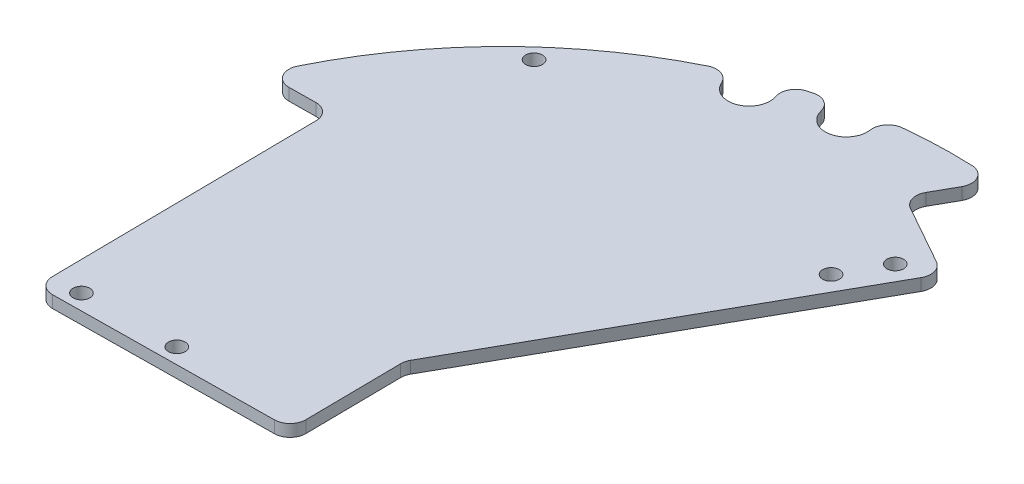
ISO-10303-21;
HEADER;
FILE_DESCRIPTION(('STEP AP214'),'2;1');
FILE_NAME('part.step','',(''),(''),'','','');
FILE_SCHEMA(('AUTOMOTIVE_DESIGN { 1 0 10303 214 1 1 1 1 }'));
ENDSEC;
DATA;
#1=APPLICATION_CONTEXT('core data for automotive mechanical design processes');
#2=APPLICATION_PROTOCOL_DEFINITION('international standard','automotive_design',2000,#1);
#3=PRODUCT_CONTEXT('',#1,'mechanical');
#4=PRODUCT('Part','Part','',(#3));
#5=PRODUCT_RELATED_PRODUCT_CATEGORY('part','',(#4));
#6=PRODUCT_DEFINITION_FORMATION('','',#4);
#7=PRODUCT_DEFINITION_CONTEXT('part definition',#1,'design');
#8=PRODUCT_DEFINITION('design','',#6,#7);
#9=PRODUCT_DEFINITION_SHAPE('','',#8);
#10=(LENGTH_UNIT() NAMED_UNIT(*) SI_UNIT(.MILLI.,.METRE.));
#11=(NAMED_UNIT(*) PLANE_ANGLE_UNIT() SI_UNIT($,.RADIAN.));
#12=(NAMED_UNIT(*) SI_UNIT($,.STERADIAN.) SOLID_ANGLE_UNIT());
#13=UNCERTAINTY_MEASURE_WITH_UNIT(LENGTH_MEASURE(1.E-05),#10,'distance_accuracy_value','');
#14=(GEOMETRIC_REPRESENTATION_CONTEXT(3) GLOBAL_UNCERTAINTY_ASSIGNED_CONTEXT((#13)) GLOBAL_UNIT_ASSIGNED_CONTEXT((#10,
#11,#12)) REPRESENTATION_CONTEXT('',''));
#15=CARTESIAN_POINT('',(0.,0.,0.));
#16=DIRECTION('',(0.,0.,1.));
#17=DIRECTION('',(1.,0.,0.));
#18=AXIS2_PLACEMENT_3D('',#15,#16,#17);
#19=CARTESIAN_POINT('',(2.70616862252382E-13,2.3,5.06539254985228E-13));
#20=DIRECTION('',(0.,-1.,0.));
#21=DIRECTION('',(0.,0.,-1.));
#22=AXIS2_PLACEMENT_3D('',#19,#20,#21);
#23=CYLINDRICAL_SURFACE('',#22,86.0000000000001);
#24=CARTESIAN_POINT('',(2.70616862252382E-13,2.3,5.06539254985228E-13));
#25=DIRECTION('',(0.,1.,0.));
#26=DIRECTION('',(0.,0.,1.));
#27=AXIS2_PLACEMENT_3D('',#24,#25,#26);
#28=CIRCLE('',#27,86.0000000000001);
#29=CARTESIAN_POINT('',(-23.5006192355601,2.3,-82.7267846319748));
#30=VERTEX_POINT('',#29);
#31=CARTESIAN_POINT('',(-24.4914733821832,2.3,-82.4388726971065));
#32=VERTEX_POINT('',#31);
#33=EDGE_CURVE('E271',#30,#32,#28,.T.);
#34=ORIENTED_EDGE('',*,*,#33,.F.);
#35=DIRECTION('',(0.,-1.,0.));
#36=VECTOR('',#35,1.);
#37=CARTESIAN_POINT('',(-23.5006192355601,2.3,-82.7267846319748));
#38=LINE('',#37,#36);
#39=CARTESIAN_POINT('',(-23.5006192355601,0.,-82.7267846319748));
#40=VERTEX_POINT('',#39);
#41=EDGE_CURVE('E459',#30,#40,#38,.T.);
#42=ORIENTED_EDGE('',*,*,#41,.T.);
#43=CARTESIAN_POINT('',(2.70616862252382E-13,0.,5.06539254985228E-13));
#44=DIRECTION('',(0.,1.,0.));
#45=DIRECTION('',(0.,0.,1.));
#46=AXIS2_PLACEMENT_3D('',#43,#44,#45);
#47=CIRCLE('',#46,86.0000000000001);
#48=CARTESIAN_POINT('',(-24.4914733821832,0.,-82.4388726971065));
#49=VERTEX_POINT('',#48);
#50=EDGE_CURVE('E241',#40,#49,#47,.T.);
#51=ORIENTED_EDGE('',*,*,#50,.T.);
#52=DIRECTION('',(0.,-1.,0.));
#53=VECTOR('',#52,1.);
#54=CARTESIAN_POINT('',(-24.4914733821832,2.3,-82.4388726971065));
#55=LINE('',#54,#53);
#56=EDGE_CURVE('E455',#49,#32,#55,.F.);
#57=ORIENTED_EDGE('',*,*,#56,.T.);
#58=EDGE_LOOP('',(#34,#42,#51,#57));
#59=FACE_BOUND('',#58,.T.);
#60=ADVANCED_FACE('F44',(#59),#23,.T.);
#61=CARTESIAN_POINT('',(3.70634819262841,0.,-85.9200965029424));
#62=VERTEX_POINT('',#61);
#63=CARTESIAN_POINT('',(-9.27498176513942,0.,-85.4983901208453));
#64=VERTEX_POINT('',#63);
#65=EDGE_CURVE('E226',#62,#64,#47,.T.);
#66=ORIENTED_EDGE('',*,*,#65,.T.);
#67=DIRECTION('',(0.,-1.,0.));
#68=VECTOR('',#67,1.);
#69=CARTESIAN_POINT('',(-9.27498176513942,2.3,-85.4983901208453));
#70=LINE('',#69,#68);
#71=CARTESIAN_POINT('',(-9.27498176513942,2.3,-85.4983901208453));
#72=VERTEX_POINT('',#71);
#73=EDGE_CURVE('E425',#64,#72,#70,.F.);
#74=ORIENTED_EDGE('',*,*,#73,.T.);
#75=CARTESIAN_POINT('',(3.70634819262841,2.3,-85.9200965029424));
#76=VERTEX_POINT('',#75);
#77=EDGE_CURVE('E229',#76,#72,#28,.T.);
#78=ORIENTED_EDGE('',*,*,#77,.F.);
#79=DIRECTION('',(0.,-1.,0.));
#80=VECTOR('',#79,1.);
#81=CARTESIAN_POINT('',(3.70634819262841,2.3,-85.9200965029424));
#82=LINE('',#81,#80);
#83=EDGE_CURVE('E212',#76,#62,#82,.T.);
#84=ORIENTED_EDGE('',*,*,#83,.T.);
#85=EDGE_LOOP('',(#66,#74,#78,#84));
#86=FACE_BOUND('',#85,.T.);
#87=ADVANCED_FACE('F224',(#86),#23,.T.);
#88=CARTESIAN_POINT('',(-37.987261940775,2.3,-77.1554789385878));
#89=VERTEX_POINT('',#88);
#90=CARTESIAN_POINT('',(-77.1712220659256,2.3,-37.9552695267934));
#91=VERTEX_POINT('',#90);
#92=EDGE_CURVE('E272',#89,#91,#28,.T.);
#93=ORIENTED_EDGE('',*,*,#92,.F.);
#94=DIRECTION('',(0.,-1.,0.));
#95=VECTOR('',#94,1.);
#96=CARTESIAN_POINT('',(-37.987261940775,2.3,-77.1554789385878));
#97=LINE('',#96,#95);
#98=CARTESIAN_POINT('',(-37.987261940775,0.,-77.1554789385878));
#99=VERTEX_POINT('',#98);
#100=EDGE_CURVE('E462',#89,#99,#97,.T.);
#101=ORIENTED_EDGE('',*,*,#100,.T.);
#102=CARTESIAN_POINT('',(-77.1712220659256,0.,-37.9552695267934));
#103=VERTEX_POINT('',#102);
#104=EDGE_CURVE('E243',#99,#103,#47,.T.);
#105=ORIENTED_EDGE('',*,*,#104,.T.);
#106=DIRECTION('',(0.,-1.,0.));
#107=VECTOR('',#106,1.);
#108=CARTESIAN_POINT('',(-77.1712220659256,2.3,-37.9552695267934));
#109=LINE('',#108,#107);
#110=EDGE_CURVE('E232',#103,#91,#109,.F.);
#111=ORIENTED_EDGE('',*,*,#110,.T.);
#112=EDGE_LOOP('',(#93,#101,#105,#111));
#113=FACE_BOUND('',#112,.T.);
#114=ADVANCED_FACE('F588',(#113),#23,.T.);
#115=CARTESIAN_POINT('',(-0.403581113949458,2.3,-34.4976393726353));
#116=DIRECTION('',(0.0116980033028831,0.,0.999931576018442));
#117=DIRECTION('',(0.999931576018442,0.,-0.0116980033028831));
#118=AXIS2_PLACEMENT_3D('',#115,#116,#117);
#119=PLANE('',#118);
#120=DIRECTION('',(-0.999931576018442,0.,0.0116980033028831));
#121=VECTOR('',#120,1.);
#122=CARTESIAN_POINT('',(-0.403581113949458,0.,-34.4976393726353));
#123=LINE('',#122,#121);
#124=CARTESIAN_POINT('',(-69.3988598592225,0.,-33.6904771447364));
#125=VERTEX_POINT('',#124);
#126=CARTESIAN_POINT('',(-74.4441086816242,0.,-33.6314537687337));
#127=VERTEX_POINT('',#126);
#128=EDGE_CURVE('E240',#125,#127,#123,.T.);
#129=ORIENTED_EDGE('',*,*,#128,.F.);
#130=DIRECTION('',(0.,-1.,0.));
#131=VECTOR('',#130,1.);
#132=CARTESIAN_POINT('',(-69.3988598592225,2.3,-33.6904771447364));
#133=LINE('',#132,#131);
#134=CARTESIAN_POINT('',(-69.3988598592225,2.3,-33.6904771447364));
#135=VERTEX_POINT('',#134);
#136=EDGE_CURVE('E398',#125,#135,#133,.F.);
#137=ORIENTED_EDGE('',*,*,#136,.T.);
#138=DIRECTION('',(-0.999931576018442,0.,0.0116980033028831));
#139=VECTOR('',#138,1.);
#140=CARTESIAN_POINT('',(-0.403581113949458,2.3,-34.4976393726353));
#141=LINE('',#140,#139);
#142=CARTESIAN_POINT('',(-74.4441086816242,2.3,-33.6314537687337));
#143=VERTEX_POINT('',#142);
#144=EDGE_CURVE('E270',#135,#143,#141,.T.);
#145=ORIENTED_EDGE('',*,*,#144,.T.);
#146=DIRECTION('',(0.,1.,0.));
#147=VECTOR('',#146,1.);
#148=CARTESIAN_POINT('',(-74.4441086816242,0.,-33.6314537687337));
#149=LINE('',#148,#147);
#150=EDGE_CURVE('E394',#143,#127,#149,.F.);
#151=ORIENTED_EDGE('',*,*,#150,.T.);
#152=EDGE_LOOP('',(#129,#137,#145,#151));
#153=FACE_BOUND('',#152,.T.);
#154=ADVANCED_FACE('F596',(#153),#119,.T.);
#155=CARTESIAN_POINT('',(-65.9954840172177,2.3,0.772068217990372));
#156=DIRECTION('',(-0.999931576018442,0.,0.0116980033028843));
#157=DIRECTION('',(0.0116980033028843,0.,0.999931576018442));
#158=AXIS2_PLACEMENT_3D('',#155,#156,#157);
#159=PLANE('',#158);
#160=DIRECTION('',(-0.0116980033028843,0.,-0.999931576018442));
#161=VECTOR('',#160,1.);
#162=CARTESIAN_POINT('',(-65.9954840172177,0.,0.772068217990372));
#163=LINE('',#162,#161);
#164=CARTESIAN_POINT('',(-65.7673729528114,0.,20.2707339503508));
#165=VERTEX_POINT('',#164);
#166=CARTESIAN_POINT('',(-66.3639711212585,0.,-30.7257764265897));
#167=VERTEX_POINT('',#166);
#168=EDGE_CURVE('E247',#165,#167,#163,.T.);
#169=ORIENTED_EDGE('',*,*,#168,.F.);
#170=DIRECTION('',(0.,-1.,0.));
#171=VECTOR('',#170,1.);
#172=CARTESIAN_POINT('',(-65.7673729528114,2.3,20.2707339503508));
#173=LINE('',#172,#171);
#174=CARTESIAN_POINT('',(-65.7673729528114,2.3,20.2707339503508));
#175=VERTEX_POINT('',#174);
#176=EDGE_CURVE('E391',#165,#175,#173,.F.);
#177=ORIENTED_EDGE('',*,*,#176,.T.);
#178=DIRECTION('',(-0.0116980033028843,0.,-0.999931576018442));
#179=VECTOR('',#178,1.);
#180=CARTESIAN_POINT('',(-65.9954840172177,2.3,0.772068217990372));
#181=LINE('',#180,#179);
#182=CARTESIAN_POINT('',(-66.3639711212585,2.3,-30.7257764265897));
#183=VERTEX_POINT('',#182);
#184=EDGE_CURVE('E276',#175,#183,#181,.T.);
#185=ORIENTED_EDGE('',*,*,#184,.T.);
#186=DIRECTION('',(0.,-1.,0.));
#187=VECTOR('',#186,1.);
#188=CARTESIAN_POINT('',(-66.3639711212585,0.,-30.7257764265897));
#189=LINE('',#188,#187);
#190=EDGE_CURVE('E387',#183,#167,#189,.T.);
#191=ORIENTED_EDGE('',*,*,#190,.T.);
#192=EDGE_LOOP('',(#169,#177,#185,#191));
#193=FACE_BOUND('',#192,.T.);
#194=ADVANCED_FACE('F527',(#193),#159,.T.);
#195=CARTESIAN_POINT('',(0.263205074314909,2.3,22.4984604604158));
#196=DIRECTION('',(0.0116980033028844,0.,0.999931576018442));
#197=DIRECTION('',(0.999931576018442,0.,-0.0116980033028844));
#198=AXIS2_PLACEMENT_3D('',#195,#196,#197);
#199=PLANE('',#198);
#200=DIRECTION('',(-0.999931576018442,0.,0.0116980033028845));
#201=VECTOR('',#200,1.);
#202=CARTESIAN_POINT('',(0.263205074314909,0.,22.4984604604158));
#203=LINE('',#202,#201);
#204=CARTESIAN_POINT('',(-20.8520979978376,0.,22.7454842478463));
#205=VERTEX_POINT('',#204);
#206=CARTESIAN_POINT('',(-62.7324842148475,0.,23.2354346684975));
#207=VERTEX_POINT('',#206);
#208=EDGE_CURVE('E517',#205,#207,#203,.T.);
#209=ORIENTED_EDGE('',*,*,#208,.F.);
#210=DIRECTION('',(0.,-1.,0.));
#211=VECTOR('',#210,1.);
#212=CARTESIAN_POINT('',(-20.8520979978376,2.3,22.7454842478463));
#213=LINE('',#212,#211);
#214=CARTESIAN_POINT('',(-20.8520979978376,2.3,22.7454842478463));
#215=VERTEX_POINT('',#214);
#216=EDGE_CURVE('E384',#205,#215,#213,.F.);
#217=ORIENTED_EDGE('',*,*,#216,.T.);
#218=DIRECTION('',(-0.999931576018442,0.,0.0116980033028845));
#219=VECTOR('',#218,1.);
#220=CARTESIAN_POINT('',(0.263205074314909,2.3,22.4984604604158));
#221=LINE('',#220,#219);
#222=CARTESIAN_POINT('',(-62.7324842148475,2.3,23.2354346684975));
#223=VERTEX_POINT('',#222);
#224=EDGE_CURVE('E280',#215,#223,#221,.T.);
#225=ORIENTED_EDGE('',*,*,#224,.T.);
#226=DIRECTION('',(0.,-1.,0.));
#227=VECTOR('',#226,1.);
#228=CARTESIAN_POINT('',(-62.7324842148474,2.3,23.2354346684975));
#229=LINE('',#228,#227);
#230=EDGE_CURVE('E380',#223,#207,#229,.T.);
#231=ORIENTED_EDGE('',*,*,#230,.T.);
#232=EDGE_LOOP('',(#209,#217,#225,#231));
#233=FACE_BOUND('',#232,.T.);
#234=ADVANCED_FACE('F538',(#233),#199,.T.);
#235=CARTESIAN_POINT('',(-18.1155083440972,2.3,0.211929777521855));
#236=DIRECTION('',(0.999931576018442,0.,-0.0116980033028837));
#237=DIRECTION('',(-0.0116980033028837,0.,-0.999931576018442));
#238=AXIS2_PLACEMENT_3D('',#235,#236,#237);
#239=PLANE('',#238);
#240=DIRECTION('',(0.0116980033028837,0.,0.999931576018442));
#241=VECTOR('',#240,1.);
#242=CARTESIAN_POINT('',(-18.1155083440972,0.,0.211929777521855));
#243=LINE('',#242,#241);
#244=CARTESIAN_POINT('',(-18.1016698925678,0.,1.39482435270254));
#245=VERTEX_POINT('',#244);
#246=CARTESIAN_POINT('',(-17.887397279691,0.,19.7105955098823));
#247=VERTEX_POINT('',#246);
#248=EDGE_CURVE('E513',#245,#247,#243,.T.);
#249=ORIENTED_EDGE('',*,*,#248,.F.);
#250=DIRECTION('',(0.,-1.,0.));
#251=VECTOR('',#250,1.);
#252=CARTESIAN_POINT('',(-18.1016698925678,2.3,1.39482435270254));
#253=LINE('',#252,#251);
#254=CARTESIAN_POINT('',(-18.1016698925678,2.3,1.39482435270254));
#255=VERTEX_POINT('',#254);
#256=EDGE_CURVE('E377',#245,#255,#253,.F.);
#257=ORIENTED_EDGE('',*,*,#256,.T.);
#258=DIRECTION('',(0.0116980033028837,0.,0.999931576018442));
#259=VECTOR('',#258,1.);
#260=CARTESIAN_POINT('',(-18.1155083440972,2.3,0.211929777521855));
#261=LINE('',#260,#259);
#262=CARTESIAN_POINT('',(-17.887397279691,2.3,19.7105955098823));
#263=VERTEX_POINT('',#262);
#264=EDGE_CURVE('E284',#255,#263,#261,.T.);
#265=ORIENTED_EDGE('',*,*,#264,.T.);
#266=DIRECTION('',(0.,-1.,0.));
#267=VECTOR('',#266,1.);
#268=CARTESIAN_POINT('',(-17.887397279691,2.3,19.7105955098823));
#269=LINE('',#268,#267);
#270=EDGE_CURVE('E373',#263,#247,#269,.T.);
#271=ORIENTED_EDGE('',*,*,#270,.T.);
#272=EDGE_LOOP('',(#249,#257,#265,#271));
#273=FACE_BOUND('',#272,.T.);
#274=ADVANCED_FACE('F547',(#273),#239,.T.);
#275=CARTESIAN_POINT('',(-13.5131348022104,2.3,-7.59244280961925));
#276=DIRECTION('',(0.871815148529614,0.,0.489835019975386));
#277=DIRECTION('',(0.489835019975386,0.,-0.871815148529614));
#278=AXIS2_PLACEMENT_3D('',#275,#276,#277);
#279=PLANE('',#278);
#280=DIRECTION('',(-0.489835019975386,0.,0.871815148529615));
#281=VECTOR('',#280,1.);
#282=CARTESIAN_POINT('',(-13.5131348022104,0.,-7.59244280961925));
#283=LINE('',#282,#281);
#284=CARTESIAN_POINT('',(17.3464714562384,0.,-62.516797166984));
#285=VERTEX_POINT('',#284);
#286=CARTESIAN_POINT('',(-17.7173206101013,0.,-0.109774717132265));
#287=VERTEX_POINT('',#286);
#288=EDGE_CURVE('E509',#285,#287,#283,.T.);
#289=ORIENTED_EDGE('',*,*,#288,.F.);
#290=DIRECTION('',(0.,-1.,0.));
#291=VECTOR('',#290,1.);
#292=CARTESIAN_POINT('',(17.3464714562384,2.3,-62.516797166984));
#293=LINE('',#292,#291);
#294=CARTESIAN_POINT('',(17.3464714562384,2.3,-62.516797166984));
#295=VERTEX_POINT('',#294);
#296=EDGE_CURVE('E370',#285,#295,#293,.F.);
#297=ORIENTED_EDGE('',*,*,#296,.T.);
#298=DIRECTION('',(-0.489835019975386,0.,0.871815148529615));
#299=VECTOR('',#298,1.);
#300=CARTESIAN_POINT('',(-13.5131348022104,2.3,-7.59244280961925));
#301=LINE('',#300,#299);
#302=CARTESIAN_POINT('',(-17.7173206101013,2.3,-0.109774717132265));
#303=VERTEX_POINT('',#302);
#304=EDGE_CURVE('E288',#295,#303,#301,.T.);
#305=ORIENTED_EDGE('',*,*,#304,.T.);
#306=DIRECTION('',(0.,-1.,0.));
#307=VECTOR('',#306,1.);
#308=CARTESIAN_POINT('',(-17.7173206101013,0.,-0.109774717132265));
#309=LINE('',#308,#307);
#310=EDGE_CURVE('E366',#303,#287,#309,.T.);
#311=ORIENTED_EDGE('',*,*,#310,.T.);
#312=EDGE_LOOP('',(#289,#297,#305,#311));
#313=FACE_BOUND('',#312,.T.);
#314=ADVANCED_FACE('F556',(#313),#279,.T.);
#315=CARTESIAN_POINT('',(32.329111318375,2.3,-57.5397998029536));
#316=DIRECTION('',(-0.489835019975386,0.,0.871815148529614));
#317=DIRECTION('',(0.871815148529614,0.,0.489835019975386));
#318=AXIS2_PLACEMENT_3D('',#315,#316,#317);
#319=PLANE('',#318);
#320=DIRECTION('',(-0.871815148529614,0.,-0.489835019975386));
#321=VECTOR('',#320,1.);
#322=CARTESIAN_POINT('',(32.329111318375,0.,-57.5397998029536));
#323=LINE('',#322,#321);
#324=CARTESIAN_POINT('',(16.2005310705757,0.,-66.601747672499));
#325=VERTEX_POINT('',#324);
#326=CARTESIAN_POINT('',(4.86693413969206,0.,-72.9696029321783));
#327=VERTEX_POINT('',#326);
#328=EDGE_CURVE('E505',#325,#327,#323,.T.);
#329=ORIENTED_EDGE('',*,*,#328,.T.);
#330=DIRECTION('',(0.,-1.,0.));
#331=VECTOR('',#330,1.);
#332=CARTESIAN_POINT('',(4.86693413969206,2.3,-72.9696029321783));
#333=LINE('',#332,#331);
#334=CARTESIAN_POINT('',(4.86693413969206,2.3,-72.9696029321783));
#335=VERTEX_POINT('',#334);
#336=EDGE_CURVE('E363',#327,#335,#333,.F.);
#337=ORIENTED_EDGE('',*,*,#336,.T.);
#338=DIRECTION('',(-0.871815148529614,0.,-0.489835019975386));
#339=VECTOR('',#338,1.);
#340=CARTESIAN_POINT('',(32.329111318375,2.3,-57.5397998029536));
#341=LINE('',#340,#339);
#342=CARTESIAN_POINT('',(16.2005310705757,2.3,-66.601747672499));
#343=VERTEX_POINT('',#342);
#344=EDGE_CURVE('E292',#343,#335,#341,.T.);
#345=ORIENTED_EDGE('',*,*,#344,.F.);
#346=DIRECTION('',(0.,-1.,0.));
#347=VECTOR('',#346,1.);
#348=CARTESIAN_POINT('',(16.2005310705757,0.,-66.601747672499));
#349=LINE('',#348,#347);
#350=EDGE_CURVE('E359',#343,#325,#349,.T.);
#351=ORIENTED_EDGE('',*,*,#350,.T.);
#352=EDGE_LOOP('',(#329,#337,#345,#351));
#353=FACE_BOUND('',#352,.T.);
#354=ADVANCED_FACE('F564',(#353),#319,.F.);
#355=CARTESIAN_POINT('',(-60.26774928471,2.3,20.2063949321849));
#356=DIRECTION('',(0.,-1.,0.));
#357=DIRECTION('',(0.,0.,-1.));
#358=AXIS2_PLACEMENT_3D('',#355,#356,#357);
#359=CYLINDRICAL_SURFACE('',#358,1.60000000000002);
#360=CARTESIAN_POINT('',(-60.26774928471,2.3,20.2063949321849));
#361=DIRECTION('',(0.,1.,0.));
#362=DIRECTION('',(0.,0.,1.));
#363=AXIS2_PLACEMENT_3D('',#360,#361,#362);
#364=CIRCLE('',#363,1.60000000000002);
#365=CARTESIAN_POINT('',(-60.26774928471,2.3,21.806394932185));
#366=VERTEX_POINT('',#365);
#367=EDGE_CURVE('E312',#366,#366,#364,.T.);
#368=ORIENTED_EDGE('',*,*,#367,.T.);
#369=EDGE_LOOP('',(#368));
#370=FACE_BOUND('',#369,.T.);
#371=CARTESIAN_POINT('',(-60.26774928471,0.,20.2063949321849));
#372=DIRECTION('',(0.,1.,0.));
#373=DIRECTION('',(0.,0.,1.));
#374=AXIS2_PLACEMENT_3D('',#371,#372,#373);
#375=CIRCLE('',#374,1.60000000000002);
#376=CARTESIAN_POINT('',(-60.26774928471,0.,21.806394932185));
#377=VERTEX_POINT('',#376);
#378=EDGE_CURVE('E482',#377,#377,#375,.T.);
#379=ORIENTED_EDGE('',*,*,#378,.F.);
#380=EDGE_LOOP('',(#379));
#381=FACE_BOUND('',#380,.T.);
#382=ADVANCED_FACE('F647',(#370,#381),#359,.F.);
#383=CARTESIAN_POINT('',(-42.268980916378,2.3,19.995830872733));
#384=DIRECTION('',(0.,-1.,0.));
#385=DIRECTION('',(0.,0.,-1.));
#386=AXIS2_PLACEMENT_3D('',#383,#384,#385);
#387=CYLINDRICAL_SURFACE('',#386,1.60000000000002);
#388=CARTESIAN_POINT('',(-42.268980916378,2.3,19.995830872733));
#389=DIRECTION('',(0.,1.,0.));
#390=DIRECTION('',(0.,0.,1.));
#391=AXIS2_PLACEMENT_3D('',#388,#389,#390);
#392=CIRCLE('',#391,1.60000000000002);
#393=CARTESIAN_POINT('',(-42.268980916378,2.3,21.595830872733));
#394=VERTEX_POINT('',#393);
#395=EDGE_CURVE('E308',#394,#394,#392,.T.);
#396=ORIENTED_EDGE('',*,*,#395,.T.);
#397=EDGE_LOOP('',(#396));
#398=FACE_BOUND('',#397,.T.);
#399=CARTESIAN_POINT('',(-42.268980916378,0.,19.995830872733));
#400=DIRECTION('',(0.,1.,0.));
#401=DIRECTION('',(0.,0.,1.));
#402=AXIS2_PLACEMENT_3D('',#399,#400,#401);
#403=CIRCLE('',#402,1.60000000000002);
#404=CARTESIAN_POINT('',(-42.268980916378,0.,21.595830872733));
#405=VERTEX_POINT('',#404);
#406=EDGE_CURVE('E487',#405,#405,#403,.T.);
#407=ORIENTED_EDGE('',*,*,#406,.F.);
#408=EDGE_LOOP('',(#407));
#409=FACE_BOUND('',#408,.T.);
#410=ADVANCED_FACE('F650',(#398,#409),#387,.F.);
#411=CARTESIAN_POINT('',(8.22610813240298,2.3,-54.4502630387947));
#412=DIRECTION('',(0.,-1.,0.));
#413=DIRECTION('',(0.,0.,-1.));
#414=AXIS2_PLACEMENT_3D('',#411,#412,#413);
#415=CYLINDRICAL_SURFACE('',#414,1.60000000000001);
#416=CARTESIAN_POINT('',(8.22610813240298,2.3,-54.4502630387947));
#417=DIRECTION('',(0.,1.,0.));
#418=DIRECTION('',(0.,0.,1.));
#419=AXIS2_PLACEMENT_3D('',#416,#417,#418);
#420=CIRCLE('',#419,1.60000000000001);
#421=CARTESIAN_POINT('',(8.22610813240298,2.3,-52.8502630387947));
#422=VERTEX_POINT('',#421);
#423=EDGE_CURVE('E304',#422,#422,#420,.T.);
#424=ORIENTED_EDGE('',*,*,#423,.T.);
#425=EDGE_LOOP('',(#424));
#426=FACE_BOUND('',#425,.T.);
#427=CARTESIAN_POINT('',(8.22610813240298,0.,-54.4502630387947));
#428=DIRECTION('',(0.,1.,0.));
#429=DIRECTION('',(0.,0.,1.));
#430=AXIS2_PLACEMENT_3D('',#427,#428,#429);
#431=CIRCLE('',#430,1.60000000000001);
#432=CARTESIAN_POINT('',(8.22610813240298,0.,-52.8502630387947));
#433=VERTEX_POINT('',#432);
#434=EDGE_CURVE('E492',#433,#433,#431,.T.);
#435=ORIENTED_EDGE('',*,*,#434,.F.);
#436=EDGE_LOOP('',(#435));
#437=FACE_BOUND('',#436,.T.);
#438=ADVANCED_FACE('F582',(#426,#437),#415,.F.);
#439=CARTESIAN_POINT('',(12.6346233121813,2.3,-62.2965993755613));
#440=DIRECTION('',(0.,-1.,0.));
#441=DIRECTION('',(0.,0.,-1.));
#442=AXIS2_PLACEMENT_3D('',#439,#440,#441);
#443=CYLINDRICAL_SURFACE('',#442,1.60000000000001);
#444=CARTESIAN_POINT('',(12.6346233121813,2.3,-62.2965993755613));
#445=DIRECTION('',(0.,1.,0.));
#446=DIRECTION('',(0.,0.,1.));
#447=AXIS2_PLACEMENT_3D('',#444,#445,#446);
#448=CIRCLE('',#447,1.60000000000001);
#449=CARTESIAN_POINT('',(12.6346233121813,2.3,-60.6965993755613));
#450=VERTEX_POINT('',#449);
#451=EDGE_CURVE('E300',#450,#450,#448,.T.);
#452=ORIENTED_EDGE('',*,*,#451,.T.);
#453=EDGE_LOOP('',(#452));
#454=FACE_BOUND('',#453,.T.);
#455=CARTESIAN_POINT('',(12.6346233121813,0.,-62.2965993755613));
#456=DIRECTION('',(0.,1.,0.));
#457=DIRECTION('',(0.,0.,1.));
#458=AXIS2_PLACEMENT_3D('',#455,#456,#457);
#459=CIRCLE('',#458,1.60000000000001);
#460=CARTESIAN_POINT('',(12.6346233121813,0.,-60.6965993755613));
#461=VERTEX_POINT('',#460);
#462=EDGE_CURVE('E498',#461,#461,#459,.T.);
#463=ORIENTED_EDGE('',*,*,#462,.F.);
#464=EDGE_LOOP('',(#463));
#465=FACE_BOUND('',#464,.T.);
#466=ADVANCED_FACE('F575',(#454,#465),#443,.F.);
#467=CARTESIAN_POINT('',(-30.0776226242717,2.3,-16.8993081891508));
#468=DIRECTION('',(-0.871815148529615,0.,-0.489835019975385));
#469=DIRECTION('',(-0.489835019975385,0.,0.871815148529615));
#470=AXIS2_PLACEMENT_3D('',#467,#468,#469);
#471=PLANE('',#470);
#472=DIRECTION('',(0.489835019975385,0.,-0.871815148529615));
#473=VECTOR('',#472,1.);
#474=CARTESIAN_POINT('',(-30.0776226242717,0.,-16.8993081891508));
#475=LINE('',#474,#473);
#476=CARTESIAN_POINT('',(3.72099375402938,0.,-77.0545534376933));
#477=VERTEX_POINT('',#476);
#478=CARTESIAN_POINT('',(6.19250242219533,0.,-81.4533787743089));
#479=VERTEX_POINT('',#478);
#480=EDGE_CURVE('E502',#477,#479,#475,.T.);
#481=ORIENTED_EDGE('',*,*,#480,.T.);
#482=DIRECTION('',(0.,-1.,0.));
#483=VECTOR('',#482,1.);
#484=CARTESIAN_POINT('',(6.19250242219534,2.3,-81.4533787743089));
#485=LINE('',#484,#483);
#486=CARTESIAN_POINT('',(6.19250242219533,2.3,-81.4533787743089));
#487=VERTEX_POINT('',#486);
#488=EDGE_CURVE('E213',#479,#487,#485,.F.);
#489=ORIENTED_EDGE('',*,*,#488,.T.);
#490=DIRECTION('',(0.489835019975385,0.,-0.871815148529615));
#491=VECTOR('',#490,1.);
#492=CARTESIAN_POINT('',(-30.0776226242717,2.3,-16.8993081891508));
#493=LINE('',#492,#491);
#494=CARTESIAN_POINT('',(3.72099375402938,2.3,-77.0545534376933));
#495=VERTEX_POINT('',#494);
#496=EDGE_CURVE('E296',#495,#487,#493,.T.);
#497=ORIENTED_EDGE('',*,*,#496,.F.);
#498=DIRECTION('',(0.,-1.,0.));
#499=VECTOR('',#498,1.);
#500=CARTESIAN_POINT('',(3.72099375402938,0.,-77.0545534376933));
#501=LINE('',#500,#499);
#502=EDGE_CURVE('E218',#495,#477,#501,.T.);
#503=ORIENTED_EDGE('',*,*,#502,.T.);
#504=EDGE_LOOP('',(#481,#489,#497,#503));
#505=FACE_BOUND('',#504,.T.);
#506=ADVANCED_FACE('F572',(#505),#471,.F.);
#507=CARTESIAN_POINT('',(-55.6334746620582,2.3,-61.5947765401098));
#508=DIRECTION('',(0.,-1.,0.));
#509=DIRECTION('',(0.,0.,-1.));
#510=AXIS2_PLACEMENT_3D('',#507,#508,#509);
#511=CYLINDRICAL_SURFACE('',#510,1.60000000000001);
#512=CARTESIAN_POINT('',(-55.6334746620582,2.3,-61.5947765401098));
#513=DIRECTION('',(0.,1.,0.));
#514=DIRECTION('',(0.,0.,1.));
#515=AXIS2_PLACEMENT_3D('',#512,#513,#514);
#516=CIRCLE('',#515,1.60000000000001);
#517=CARTESIAN_POINT('',(-55.6334746620582,2.3,-59.9947765401098));
#518=VERTEX_POINT('',#517);
#519=EDGE_CURVE('E315',#518,#518,#516,.T.);
#520=ORIENTED_EDGE('',*,*,#519,.T.);
#521=EDGE_LOOP('',(#520));
#522=FACE_BOUND('',#521,.T.);
#523=CARTESIAN_POINT('',(-55.6334746620582,0.,-61.5947765401098));
#524=DIRECTION('',(0.,1.,0.));
#525=DIRECTION('',(0.,0.,1.));
#526=AXIS2_PLACEMENT_3D('',#523,#524,#525);
#527=CIRCLE('',#526,1.60000000000001);
#528=CARTESIAN_POINT('',(-55.6334746620582,0.,-59.9947765401098));
#529=VERTEX_POINT('',#528);
#530=EDGE_CURVE('E326',#529,#529,#527,.T.);
#531=ORIENTED_EDGE('',*,*,#530,.F.);
#532=EDGE_LOOP('',(#531));
#533=FACE_BOUND('',#532,.T.);
#534=ADVANCED_FACE('F574',(#522,#533),#511,.F.);
#535=CARTESIAN_POINT('',(0.,2.3,0.));
#536=DIRECTION('',(0.,1.,0.));
#537=DIRECTION('',(0.,0.,1.));
#538=AXIS2_PLACEMENT_3D('',#535,#536,#537);
#539=PLANE('',#538);
#540=ORIENTED_EDGE('',*,*,#77,.T.);
#541=CARTESIAN_POINT('',(-8.95143588961129,2.3,-82.5158881398856));
#542=DIRECTION('',(0.,1.,0.));
#543=DIRECTION('',(0.,0.,1.));
#544=AXIS2_PLACEMENT_3D('',#541,#542,#543);
#545=CIRCLE('',#544,3.);
#546=CARTESIAN_POINT('',(-11.9176414516929,2.3,-82.0668619007017));
#547=VERTEX_POINT('',#546);
#548=EDGE_CURVE('E437',#72,#547,#545,.T.);
#549=ORIENTED_EDGE('',*,*,#548,.T.);
#550=CARTESIAN_POINT('',(-15.8725822011351,2.3,-81.4681602484564));
#551=DIRECTION('',(0.,1.,0.));
#552=DIRECTION('',(0.,0.,1.));
#553=AXIS2_PLACEMENT_3D('',#550,#551,#552);
#554=CIRCLE('',#553,4.);
#555=CARTESIAN_POINT('',(-19.7630096247489,2.3,-80.538335285577));
#556=VERTEX_POINT('',#555);
#557=EDGE_CURVE('E259',#556,#547,#554,.T.);
#558=ORIENTED_EDGE('',*,*,#557,.F.);
#559=CARTESIAN_POINT('',(-22.6808301924592,2.3,-79.8409665634175));
#560=DIRECTION('',(0.,1.,0.));
#561=DIRECTION('',(0.,0.,1.));
#562=AXIS2_PLACEMENT_3D('',#559,#560,#561);
#563=CIRCLE('',#562,3.);
#564=EDGE_CURVE('E434',#556,#30,#563,.T.);
#565=ORIENTED_EDGE('',*,*,#564,.T.);
#566=ORIENTED_EDGE('',*,*,#33,.T.);
#567=CARTESIAN_POINT('',(-23.6371196595489,2.3,-79.5630980681377));
#568=DIRECTION('',(0.,1.,0.));
#569=DIRECTION('',(0.,0.,1.));
#570=AXIS2_PLACEMENT_3D('',#567,#568,#569);
#571=CIRCLE('',#570,3.);
#572=CARTESIAN_POINT('',(-26.474309339564,2.3,-78.5882366833169));
#573=VERTEX_POINT('',#572);
#574=EDGE_CURVE('E428',#32,#573,#571,.T.);
#575=ORIENTED_EDGE('',*,*,#574,.T.);
#576=CARTESIAN_POINT('',(-30.2572289129177,2.3,-77.2884215035557));
#577=DIRECTION('',(0.,1.,0.));
#578=DIRECTION('',(0.,0.,1.));
#579=AXIS2_PLACEMENT_3D('',#576,#577,#578);
#580=CIRCLE('',#579,4.);
#581=CARTESIAN_POINT('',(-33.9171694748673,2.3,-75.6744713546985));
#582=VERTEX_POINT('',#581);
#583=EDGE_CURVE('E251',#582,#573,#580,.T.);
#584=ORIENTED_EDGE('',*,*,#583,.F.);
#585=CARTESIAN_POINT('',(-36.6621248963294,2.3,-74.4640087430556));
#586=DIRECTION('',(0.,1.,0.));
#587=DIRECTION('',(0.,0.,1.));
#588=AXIS2_PLACEMENT_3D('',#585,#586,#587);
#589=CIRCLE('',#588,3.);
#590=EDGE_CURVE('E431',#582,#89,#589,.T.);
#591=ORIENTED_EDGE('',*,*,#590,.T.);
#592=ORIENTED_EDGE('',*,*,#92,.T.);
#593=CARTESIAN_POINT('',(-74.4792026915328,2.3,-36.631248496789));
#594=DIRECTION('',(0.,1.,0.));
#595=DIRECTION('',(0.,0.,1.));
#596=AXIS2_PLACEMENT_3D('',#593,#594,#595);
#597=CIRCLE('',#596,3.);
#598=EDGE_CURVE('E344',#91,#143,#597,.T.);
#599=ORIENTED_EDGE('',*,*,#598,.T.);
#600=ORIENTED_EDGE('',*,*,#144,.F.);
#601=CARTESIAN_POINT('',(-69.3637658493139,2.3,-30.6906824166811));
#602=DIRECTION('',(0.,1.,0.));
#603=DIRECTION('',(0.,0.,1.));
#604=AXIS2_PLACEMENT_3D('',#601,#602,#603);
#605=CIRCLE('',#604,3.);
#606=EDGE_CURVE('E416',#135,#183,#605,.F.);
#607=ORIENTED_EDGE('',*,*,#606,.T.);
#608=ORIENTED_EDGE('',*,*,#184,.F.);
#609=CARTESIAN_POINT('',(-62.7675782247561,2.3,20.2356399404422));
#610=DIRECTION('',(0.,1.,0.));
#611=DIRECTION('',(0.,0.,1.));
#612=AXIS2_PLACEMENT_3D('',#609,#610,#611);
#613=CIRCLE('',#612,3.);
#614=EDGE_CURVE('E347',#175,#223,#613,.T.);
#615=ORIENTED_EDGE('',*,*,#614,.T.);
#616=ORIENTED_EDGE('',*,*,#224,.F.);
#617=CARTESIAN_POINT('',(-20.8871920077463,2.3,19.7456895197909));
#618=DIRECTION('',(0.,1.,0.));
#619=DIRECTION('',(0.,0.,1.));
#620=AXIS2_PLACEMENT_3D('',#617,#618,#619);
#621=CIRCLE('',#620,3.);
#622=EDGE_CURVE('E350',#215,#263,#621,.T.);
#623=ORIENTED_EDGE('',*,*,#622,.T.);
#624=ORIENTED_EDGE('',*,*,#264,.F.);
#625=CARTESIAN_POINT('',(-15.1018751645125,2.3,1.35973034279389));
#626=DIRECTION('',(0.,1.,0.));
#627=DIRECTION('',(0.,0.,1.));
#628=AXIS2_PLACEMENT_3D('',#625,#626,#627);
#629=CIRCLE('',#628,3.);
#630=EDGE_CURVE('E410',#255,#303,#629,.F.);
#631=ORIENTED_EDGE('',*,*,#630,.T.);
#632=ORIENTED_EDGE('',*,*,#304,.F.);
#633=CARTESIAN_POINT('',(14.7310260106495,2.3,-63.9863022269102));
#634=DIRECTION('',(0.,1.,0.));
#635=DIRECTION('',(0.,0.,1.));
#636=AXIS2_PLACEMENT_3D('',#633,#634,#635);
#637=CIRCLE('',#636,3.);
#638=EDGE_CURVE('E353',#295,#343,#637,.T.);
#639=ORIENTED_EDGE('',*,*,#638,.T.);
#640=ORIENTED_EDGE('',*,*,#344,.T.);
#641=CARTESIAN_POINT('',(6.33643919961823,2.3,-75.5850483777672));
#642=DIRECTION('',(0.,1.,0.));
#643=DIRECTION('',(0.,0.,1.));
#644=AXIS2_PLACEMENT_3D('',#641,#642,#643);
#645=CIRCLE('',#644,3.);
#646=EDGE_CURVE('E404',#335,#495,#645,.F.);
#647=ORIENTED_EDGE('',*,*,#646,.T.);
#648=ORIENTED_EDGE('',*,*,#496,.T.);
#649=CARTESIAN_POINT('',(3.5770569766065,2.3,-82.9228838342351));
#650=DIRECTION('',(0.,1.,0.));
#651=DIRECTION('',(0.,0.,1.));
#652=AXIS2_PLACEMENT_3D('',#649,#650,#651);
#653=CIRCLE('',#652,3.);
#654=EDGE_CURVE('E356',#487,#76,#653,.T.);
#655=ORIENTED_EDGE('',*,*,#654,.T.);
#656=EDGE_LOOP('',(#540,#549,#558,#565,#566,#575,#584,#591,#592,#599,#600,#607,#608,#615,#616,
#623,#624,#631,#632,#639,#640,#647,#648,#655));
#657=FACE_BOUND('',#656,.T.);
#658=ORIENTED_EDGE('',*,*,#451,.F.);
#659=EDGE_LOOP('',(#658));
#660=FACE_BOUND('',#659,.T.);
#661=ORIENTED_EDGE('',*,*,#423,.F.);
#662=EDGE_LOOP('',(#661));
#663=FACE_BOUND('',#662,.T.);
#664=ORIENTED_EDGE('',*,*,#395,.F.);
#665=EDGE_LOOP('',(#664));
#666=FACE_BOUND('',#665,.T.);
#667=ORIENTED_EDGE('',*,*,#367,.F.);
#668=EDGE_LOOP('',(#667));
#669=FACE_BOUND('',#668,.T.);
#670=ORIENTED_EDGE('',*,*,#519,.F.);
#671=EDGE_LOOP('',(#670));
#672=FACE_BOUND('',#671,.T.);
#673=ADVANCED_FACE('F474',(#657,#660,#663,#666,#669,#672),#539,.T.);
#674=CARTESIAN_POINT('',(0.,0.,0.));
#675=DIRECTION('',(0.,1.,0.));
#676=DIRECTION('',(0.,0.,1.));
#677=AXIS2_PLACEMENT_3D('',#674,#675,#676);
#678=PLANE('',#677);
#679=CARTESIAN_POINT('',(-15.8725822011351,0.,-81.4681602484564));
#680=DIRECTION('',(0.,1.,0.));
#681=DIRECTION('',(0.,0.,1.));
#682=AXIS2_PLACEMENT_3D('',#679,#680,#681);
#683=CIRCLE('',#682,4.);
#684=CARTESIAN_POINT('',(-19.7630096247489,0.,-80.538335285577));
#685=VERTEX_POINT('',#684);
#686=CARTESIAN_POINT('',(-11.9176414516929,0.,-82.0668619007017));
#687=VERTEX_POINT('',#686);
#688=EDGE_CURVE('E419',#685,#687,#683,.T.);
#689=ORIENTED_EDGE('',*,*,#688,.T.);
#690=CARTESIAN_POINT('',(-8.95143588961129,0.,-82.5158881398856));
#691=DIRECTION('',(0.,1.,0.));
#692=DIRECTION('',(0.,0.,1.));
#693=AXIS2_PLACEMENT_3D('',#690,#691,#692);
#694=CIRCLE('',#693,3.);
#695=EDGE_CURVE('E238',#687,#64,#694,.F.);
#696=ORIENTED_EDGE('',*,*,#695,.T.);
#697=ORIENTED_EDGE('',*,*,#65,.F.);
#698=CARTESIAN_POINT('',(3.5770569766065,0.,-82.9228838342351));
#699=DIRECTION('',(0.,1.,0.));
#700=DIRECTION('',(0.,0.,1.));
#701=AXIS2_PLACEMENT_3D('',#698,#699,#700);
#702=CIRCLE('',#701,3.);
#703=EDGE_CURVE('E208',#62,#479,#702,.F.);
#704=ORIENTED_EDGE('',*,*,#703,.T.);
#705=ORIENTED_EDGE('',*,*,#480,.F.);
#706=CARTESIAN_POINT('',(6.33643919961823,0.,-75.5850483777672));
#707=DIRECTION('',(0.,1.,0.));
#708=DIRECTION('',(0.,0.,1.));
#709=AXIS2_PLACEMENT_3D('',#706,#707,#708);
#710=CIRCLE('',#709,3.);
#711=EDGE_CURVE('E401',#477,#327,#710,.T.);
#712=ORIENTED_EDGE('',*,*,#711,.T.);
#713=ORIENTED_EDGE('',*,*,#328,.F.);
#714=CARTESIAN_POINT('',(14.7310260106495,0.,-63.9863022269102));
#715=DIRECTION('',(0.,1.,0.));
#716=DIRECTION('',(0.,0.,1.));
#717=AXIS2_PLACEMENT_3D('',#714,#715,#716);
#718=CIRCLE('',#717,3.);
#719=EDGE_CURVE('E219',#325,#285,#718,.F.);
#720=ORIENTED_EDGE('',*,*,#719,.T.);
#721=ORIENTED_EDGE('',*,*,#288,.T.);
#722=CARTESIAN_POINT('',(-15.1018751645125,0.,1.35973034279389));
#723=DIRECTION('',(0.,1.,0.));
#724=DIRECTION('',(0.,0.,1.));
#725=AXIS2_PLACEMENT_3D('',#722,#723,#724);
#726=CIRCLE('',#725,3.);
#727=EDGE_CURVE('E407',#287,#245,#726,.T.);
#728=ORIENTED_EDGE('',*,*,#727,.T.);
#729=ORIENTED_EDGE('',*,*,#248,.T.);
#730=CARTESIAN_POINT('',(-20.8871920077463,0.,19.7456895197909));
#731=DIRECTION('',(0.,1.,0.));
#732=DIRECTION('',(0.,0.,1.));
#733=AXIS2_PLACEMENT_3D('',#730,#731,#732);
#734=CIRCLE('',#733,3.);
#735=EDGE_CURVE('E334',#247,#205,#734,.F.);
#736=ORIENTED_EDGE('',*,*,#735,.T.);
#737=ORIENTED_EDGE('',*,*,#208,.T.);
#738=CARTESIAN_POINT('',(-62.7675782247561,0.,20.2356399404422));
#739=DIRECTION('',(0.,1.,0.));
#740=DIRECTION('',(0.,0.,1.));
#741=AXIS2_PLACEMENT_3D('',#738,#739,#740);
#742=CIRCLE('',#741,3.);
#743=EDGE_CURVE('E331',#207,#165,#742,.F.);
#744=ORIENTED_EDGE('',*,*,#743,.T.);
#745=ORIENTED_EDGE('',*,*,#168,.T.);
#746=CARTESIAN_POINT('',(-69.3637658493139,0.,-30.6906824166811));
#747=DIRECTION('',(0.,1.,0.));
#748=DIRECTION('',(0.,0.,1.));
#749=AXIS2_PLACEMENT_3D('',#746,#747,#748);
#750=CIRCLE('',#749,3.);
#751=EDGE_CURVE('E413',#167,#125,#750,.T.);
#752=ORIENTED_EDGE('',*,*,#751,.T.);
#753=ORIENTED_EDGE('',*,*,#128,.T.);
#754=CARTESIAN_POINT('',(-74.4792026915328,0.,-36.631248496789));
#755=DIRECTION('',(0.,1.,0.));
#756=DIRECTION('',(0.,0.,1.));
#757=AXIS2_PLACEMENT_3D('',#754,#755,#756);
#758=CIRCLE('',#757,3.);
#759=EDGE_CURVE('E231',#127,#103,#758,.F.);
#760=ORIENTED_EDGE('',*,*,#759,.T.);
#761=ORIENTED_EDGE('',*,*,#104,.F.);
#762=CARTESIAN_POINT('',(-36.6621248963294,0.,-74.4640087430556));
#763=DIRECTION('',(0.,1.,0.));
#764=DIRECTION('',(0.,0.,1.));
#765=AXIS2_PLACEMENT_3D('',#762,#763,#764);
#766=CIRCLE('',#765,3.);
#767=CARTESIAN_POINT('',(-33.9171694748673,0.,-75.6744713546985));
#768=VERTEX_POINT('',#767);
#769=EDGE_CURVE('E448',#99,#768,#766,.F.);
#770=ORIENTED_EDGE('',*,*,#769,.T.);
#771=CARTESIAN_POINT('',(-30.2572289129177,0.,-77.2884215035557));
#772=DIRECTION('',(0.,1.,0.));
#773=DIRECTION('',(0.,0.,1.));
#774=AXIS2_PLACEMENT_3D('',#771,#772,#773);
#775=CIRCLE('',#774,4.);
#776=CARTESIAN_POINT('',(-26.474309339564,0.,-78.5882366833169));
#777=VERTEX_POINT('',#776);
#778=EDGE_CURVE('E422',#768,#777,#775,.T.);
#779=ORIENTED_EDGE('',*,*,#778,.T.);
#780=CARTESIAN_POINT('',(-23.6371196595489,0.,-79.5630980681377));
#781=DIRECTION('',(0.,1.,0.));
#782=DIRECTION('',(0.,0.,1.));
#783=AXIS2_PLACEMENT_3D('',#780,#781,#782);
#784=CIRCLE('',#783,3.);
#785=EDGE_CURVE('E60',#777,#49,#784,.F.);
#786=ORIENTED_EDGE('',*,*,#785,.T.);
#787=ORIENTED_EDGE('',*,*,#50,.F.);
#788=CARTESIAN_POINT('',(-22.6808301924592,0.,-79.8409665634175));
#789=DIRECTION('',(0.,1.,0.));
#790=DIRECTION('',(0.,0.,1.));
#791=AXIS2_PLACEMENT_3D('',#788,#789,#790);
#792=CIRCLE('',#791,3.);
#793=EDGE_CURVE('E68',#40,#685,#792,.F.);
#794=ORIENTED_EDGE('',*,*,#793,.T.);
#795=EDGE_LOOP('',(#689,#696,#697,#704,#705,#712,#713,#720,#721,#728,#729,#736,#737,#744,#745,
#752,#753,#760,#761,#770,#779,#786,#787,#794));
#796=FACE_BOUND('',#795,.T.);
#797=ORIENTED_EDGE('',*,*,#462,.T.);
#798=EDGE_LOOP('',(#797));
#799=FACE_BOUND('',#798,.T.);
#800=ORIENTED_EDGE('',*,*,#434,.T.);
#801=EDGE_LOOP('',(#800));
#802=FACE_BOUND('',#801,.T.);
#803=ORIENTED_EDGE('',*,*,#406,.T.);
#804=EDGE_LOOP('',(#803));
#805=FACE_BOUND('',#804,.T.);
#806=ORIENTED_EDGE('',*,*,#378,.T.);
#807=EDGE_LOOP('',(#806));
#808=FACE_BOUND('',#807,.T.);
#809=ORIENTED_EDGE('',*,*,#530,.T.);
#810=EDGE_LOOP('',(#809));
#811=FACE_BOUND('',#810,.T.);
#812=ADVANCED_FACE('F235',(#796,#799,#802,#805,#808,#811),#678,.F.);
#813=CARTESIAN_POINT('',(3.5770569766065,2.3,-82.9228838342351));
#814=DIRECTION('',(0.,-1.,0.));
#815=DIRECTION('',(0.,0.,-1.));
#816=AXIS2_PLACEMENT_3D('',#813,#814,#815);
#817=CYLINDRICAL_SURFACE('',#816,3.);
#818=ORIENTED_EDGE('',*,*,#654,.F.);
#819=ORIENTED_EDGE('',*,*,#488,.F.);
#820=ORIENTED_EDGE('',*,*,#703,.F.);
#821=ORIENTED_EDGE('',*,*,#83,.F.);
#822=EDGE_LOOP('',(#818,#819,#820,#821));
#823=FACE_BOUND('',#822,.T.);
#824=ADVANCED_FACE('F211',(#823),#817,.T.);
#825=CARTESIAN_POINT('',(6.33643919961823,2.3,-75.5850483777672));
#826=DIRECTION('',(0.,1.,0.));
#827=DIRECTION('',(0.,0.,1.));
#828=AXIS2_PLACEMENT_3D('',#825,#826,#827);
#829=CYLINDRICAL_SURFACE('',#828,3.);
#830=ORIENTED_EDGE('',*,*,#646,.F.);
#831=ORIENTED_EDGE('',*,*,#336,.F.);
#832=ORIENTED_EDGE('',*,*,#711,.F.);
#833=ORIENTED_EDGE('',*,*,#502,.F.);
#834=EDGE_LOOP('',(#830,#831,#832,#833));
#835=FACE_BOUND('',#834,.T.);
#836=ADVANCED_FACE('F568',(#835),#829,.F.);
#837=CARTESIAN_POINT('',(14.7310260106495,2.3,-63.9863022269102));
#838=DIRECTION('',(0.,1.,0.));
#839=DIRECTION('',(0.,0.,1.));
#840=AXIS2_PLACEMENT_3D('',#837,#838,#839);
#841=CYLINDRICAL_SURFACE('',#840,3.);
#842=ORIENTED_EDGE('',*,*,#638,.F.);
#843=ORIENTED_EDGE('',*,*,#296,.F.);
#844=ORIENTED_EDGE('',*,*,#719,.F.);
#845=ORIENTED_EDGE('',*,*,#350,.F.);
#846=EDGE_LOOP('',(#842,#843,#844,#845));
#847=FACE_BOUND('',#846,.T.);
#848=ADVANCED_FACE('F559',(#847),#841,.T.);
#849=CARTESIAN_POINT('',(-15.1018751645125,2.3,1.35973034279389));
#850=DIRECTION('',(0.,1.,0.));
#851=DIRECTION('',(0.,0.,1.));
#852=AXIS2_PLACEMENT_3D('',#849,#850,#851);
#853=CYLINDRICAL_SURFACE('',#852,3.);
#854=ORIENTED_EDGE('',*,*,#630,.F.);
#855=ORIENTED_EDGE('',*,*,#256,.F.);
#856=ORIENTED_EDGE('',*,*,#727,.F.);
#857=ORIENTED_EDGE('',*,*,#310,.F.);
#858=EDGE_LOOP('',(#854,#855,#856,#857));
#859=FACE_BOUND('',#858,.T.);
#860=ADVANCED_FACE('F550',(#859),#853,.F.);
#861=CARTESIAN_POINT('',(-20.8871920077463,2.3,19.7456895197909));
#862=DIRECTION('',(0.,-1.,0.));
#863=DIRECTION('',(0.,0.,-1.));
#864=AXIS2_PLACEMENT_3D('',#861,#862,#863);
#865=CYLINDRICAL_SURFACE('',#864,3.);
#866=ORIENTED_EDGE('',*,*,#622,.F.);
#867=ORIENTED_EDGE('',*,*,#216,.F.);
#868=ORIENTED_EDGE('',*,*,#735,.F.);
#869=ORIENTED_EDGE('',*,*,#270,.F.);
#870=EDGE_LOOP('',(#866,#867,#868,#869));
#871=FACE_BOUND('',#870,.T.);
#872=ADVANCED_FACE('F541',(#871),#865,.T.);
#873=CARTESIAN_POINT('',(-62.7675782247561,2.3,20.2356399404422));
#874=DIRECTION('',(0.,-1.,0.));
#875=DIRECTION('',(0.,0.,-1.));
#876=AXIS2_PLACEMENT_3D('',#873,#874,#875);
#877=CYLINDRICAL_SURFACE('',#876,3.);
#878=ORIENTED_EDGE('',*,*,#614,.F.);
#879=ORIENTED_EDGE('',*,*,#176,.F.);
#880=ORIENTED_EDGE('',*,*,#743,.F.);
#881=ORIENTED_EDGE('',*,*,#230,.F.);
#882=EDGE_LOOP('',(#878,#879,#880,#881));
#883=FACE_BOUND('',#882,.T.);
#884=ADVANCED_FACE('F532',(#883),#877,.T.);
#885=CARTESIAN_POINT('',(-69.3637658493139,2.3,-30.6906824166811));
#886=DIRECTION('',(0.,1.,0.));
#887=DIRECTION('',(0.,0.,1.));
#888=AXIS2_PLACEMENT_3D('',#885,#886,#887);
#889=CYLINDRICAL_SURFACE('',#888,3.);
#890=ORIENTED_EDGE('',*,*,#606,.F.);
#891=ORIENTED_EDGE('',*,*,#136,.F.);
#892=ORIENTED_EDGE('',*,*,#751,.F.);
#893=ORIENTED_EDGE('',*,*,#190,.F.);
#894=EDGE_LOOP('',(#890,#891,#892,#893));
#895=FACE_BOUND('',#894,.T.);
#896=ADVANCED_FACE('F622',(#895),#889,.F.);
#897=CARTESIAN_POINT('',(-74.4792026915328,2.3,-36.631248496789));
#898=DIRECTION('',(0.,-1.,0.));
#899=DIRECTION('',(0.,0.,-1.));
#900=AXIS2_PLACEMENT_3D('',#897,#898,#899);
#901=CYLINDRICAL_SURFACE('',#900,3.);
#902=ORIENTED_EDGE('',*,*,#598,.F.);
#903=ORIENTED_EDGE('',*,*,#110,.F.);
#904=ORIENTED_EDGE('',*,*,#759,.F.);
#905=ORIENTED_EDGE('',*,*,#150,.F.);
#906=EDGE_LOOP('',(#902,#903,#904,#905));
#907=FACE_BOUND('',#906,.T.);
#908=ADVANCED_FACE('F618',(#907),#901,.T.);
#909=CARTESIAN_POINT('',(-15.8725822011351,-42.,-81.4681602484564));
#910=DIRECTION('',(0.,1.,0.));
#911=DIRECTION('',(0.,0.,1.));
#912=AXIS2_PLACEMENT_3D('',#909,#910,#911);
#913=CYLINDRICAL_SURFACE('',#912,4.);
#914=ORIENTED_EDGE('',*,*,#557,.T.);
#915=DIRECTION('',(0.,1.,0.));
#916=VECTOR('',#915,1.);
#917=CARTESIAN_POINT('',(-11.9176414516929,-42.,-82.0668619007017));
#918=LINE('',#917,#916);
#919=EDGE_CURVE('E443',#547,#687,#918,.F.);
#920=ORIENTED_EDGE('',*,*,#919,.T.);
#921=ORIENTED_EDGE('',*,*,#688,.F.);
#922=DIRECTION('',(0.,1.,0.));
#923=VECTOR('',#922,1.);
#924=CARTESIAN_POINT('',(-19.7630096247489,-42.,-80.538335285577));
#925=LINE('',#924,#923);
#926=EDGE_CURVE('E440',#685,#556,#925,.T.);
#927=ORIENTED_EDGE('',*,*,#926,.T.);
#928=EDGE_LOOP('',(#914,#920,#921,#927));
#929=FACE_BOUND('',#928,.T.);
#930=ADVANCED_FACE('F621',(#929),#913,.F.);
#931=CARTESIAN_POINT('',(-30.2572289129177,-42.,-77.2884215035557));
#932=DIRECTION('',(0.,1.,0.));
#933=DIRECTION('',(0.,0.,1.));
#934=AXIS2_PLACEMENT_3D('',#931,#932,#933);
#935=CYLINDRICAL_SURFACE('',#934,4.);
#936=ORIENTED_EDGE('',*,*,#778,.F.);
#937=DIRECTION('',(0.,1.,0.));
#938=VECTOR('',#937,1.);
#939=CARTESIAN_POINT('',(-33.9171694748673,-42.,-75.6744713546985));
#940=LINE('',#939,#938);
#941=EDGE_CURVE('E11',#768,#582,#940,.T.);
#942=ORIENTED_EDGE('',*,*,#941,.T.);
#943=ORIENTED_EDGE('',*,*,#583,.T.);
#944=DIRECTION('',(0.,1.,0.));
#945=VECTOR('',#944,1.);
#946=CARTESIAN_POINT('',(-26.474309339564,-42.,-78.5882366833169));
#947=LINE('',#946,#945);
#948=EDGE_CURVE('E53',#573,#777,#947,.F.);
#949=ORIENTED_EDGE('',*,*,#948,.T.);
#950=EDGE_LOOP('',(#936,#942,#943,#949));
#951=FACE_BOUND('',#950,.T.);
#952=ADVANCED_FACE('F466',(#951),#935,.F.);
#953=CARTESIAN_POINT('',(-8.95143588961129,-42.,-82.5158881398856));
#954=DIRECTION('',(0.,-1.,0.));
#955=DIRECTION('',(0.,0.,-1.));
#956=AXIS2_PLACEMENT_3D('',#953,#954,#955);
#957=CYLINDRICAL_SURFACE('',#956,3.);
#958=ORIENTED_EDGE('',*,*,#695,.F.);
#959=ORIENTED_EDGE('',*,*,#919,.F.);
#960=ORIENTED_EDGE('',*,*,#548,.F.);
#961=ORIENTED_EDGE('',*,*,#73,.F.);
#962=EDGE_LOOP('',(#958,#959,#960,#961));
#963=FACE_BOUND('',#962,.T.);
#964=ADVANCED_FACE('F612',(#963),#957,.T.);
#965=CARTESIAN_POINT('',(-22.6808301924592,-42.,-79.8409665634175));
#966=DIRECTION('',(0.,1.,0.));
#967=DIRECTION('',(0.,0.,1.));
#968=AXIS2_PLACEMENT_3D('',#965,#966,#967);
#969=CYLINDRICAL_SURFACE('',#968,3.);
#970=ORIENTED_EDGE('',*,*,#564,.F.);
#971=ORIENTED_EDGE('',*,*,#926,.F.);
#972=ORIENTED_EDGE('',*,*,#793,.F.);
#973=ORIENTED_EDGE('',*,*,#41,.F.);
#974=EDGE_LOOP('',(#970,#971,#972,#973));
#975=FACE_BOUND('',#974,.T.);
#976=ADVANCED_FACE('F607',(#975),#969,.T.);
#977=CARTESIAN_POINT('',(-36.6621248963294,-42.,-74.4640087430556));
#978=DIRECTION('',(0.,1.,0.));
#979=DIRECTION('',(0.,0.,1.));
#980=AXIS2_PLACEMENT_3D('',#977,#978,#979);
#981=CYLINDRICAL_SURFACE('',#980,3.);
#982=ORIENTED_EDGE('',*,*,#590,.F.);
#983=ORIENTED_EDGE('',*,*,#941,.F.);
#984=ORIENTED_EDGE('',*,*,#769,.F.);
#985=ORIENTED_EDGE('',*,*,#100,.F.);
#986=EDGE_LOOP('',(#982,#983,#984,#985));
#987=FACE_BOUND('',#986,.T.);
#988=ADVANCED_FACE('F605',(#987),#981,.T.);
#989=CARTESIAN_POINT('',(-23.6371196595489,-42.,-79.5630980681377));
#990=DIRECTION('',(0.,-1.,0.));
#991=DIRECTION('',(0.,0.,-1.));
#992=AXIS2_PLACEMENT_3D('',#989,#990,#991);
#993=CYLINDRICAL_SURFACE('',#992,3.);
#994=ORIENTED_EDGE('',*,*,#785,.F.);
#995=ORIENTED_EDGE('',*,*,#948,.F.);
#996=ORIENTED_EDGE('',*,*,#574,.F.);
#997=ORIENTED_EDGE('',*,*,#56,.F.);
#998=EDGE_LOOP('',(#994,#995,#996,#997));
#999=FACE_BOUND('',#998,.T.);
#1000=ADVANCED_FACE('F46',(#999),#993,.T.);
#1001=CLOSED_SHELL('',(#60,#87,#114,#154,#194,#234,#274,#314,#354,#382,#410,#438,#466,#506,#534,
#673,#812,#824,#836,#848,#860,#872,#884,#896,#908,#930,#952,#964,#976,#988,#1000));
#1002=MANIFOLD_SOLID_BREP('B2',#1001);
#1003=ADVANCED_BREP_SHAPE_REPRESENTATION('',(#18,#1002),#14);
#1004=SHAPE_DEFINITION_REPRESENTATION(#9,#1003);
ENDSEC;
END-ISO-10303-21;
